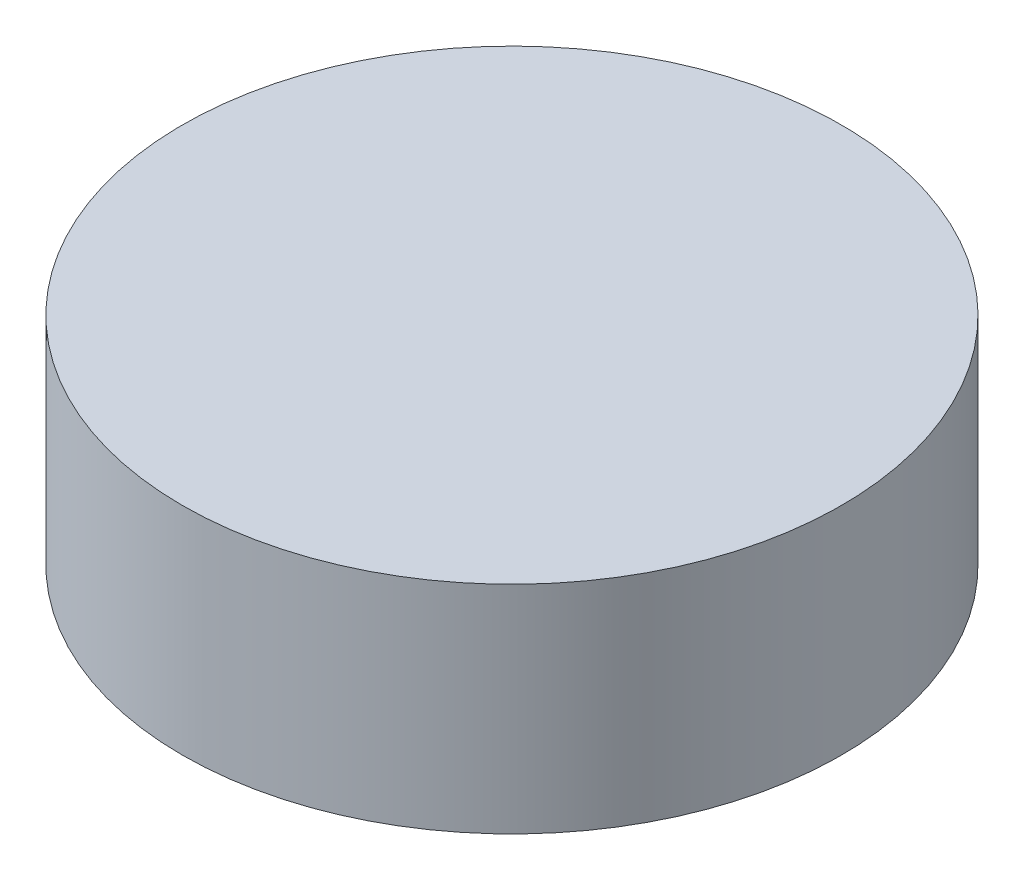
ISO-10303-21;
HEADER;
FILE_DESCRIPTION(('STEP AP214'),'2;1');
FILE_NAME('part.step','',(''),(''),'','','');
FILE_SCHEMA(('AUTOMOTIVE_DESIGN { 1 0 10303 214 1 1 1 1 }'));
ENDSEC;
DATA;
#1=APPLICATION_CONTEXT('core data for automotive mechanical design processes');
#2=APPLICATION_PROTOCOL_DEFINITION('international standard','automotive_design',2000,#1);
#3=PRODUCT_CONTEXT('',#1,'mechanical');
#4=PRODUCT('Part','Part','',(#3));
#5=PRODUCT_RELATED_PRODUCT_CATEGORY('part','',(#4));
#6=PRODUCT_DEFINITION_FORMATION('','',#4);
#7=PRODUCT_DEFINITION_CONTEXT('part definition',#1,'design');
#8=PRODUCT_DEFINITION('design','',#6,#7);
#9=PRODUCT_DEFINITION_SHAPE('','',#8);
#10=(LENGTH_UNIT() NAMED_UNIT(*) SI_UNIT(.MILLI.,.METRE.));
#11=(NAMED_UNIT(*) PLANE_ANGLE_UNIT() SI_UNIT($,.RADIAN.));
#12=(NAMED_UNIT(*) SI_UNIT($,.STERADIAN.) SOLID_ANGLE_UNIT());
#13=UNCERTAINTY_MEASURE_WITH_UNIT(LENGTH_MEASURE(1.E-05),#10,'distance_accuracy_value','');
#14=(GEOMETRIC_REPRESENTATION_CONTEXT(3) GLOBAL_UNCERTAINTY_ASSIGNED_CONTEXT((#13)) GLOBAL_UNIT_ASSIGNED_CONTEXT((#10,
#11,#12)) REPRESENTATION_CONTEXT('',''));
#15=CARTESIAN_POINT('',(0.,0.,0.));
#16=DIRECTION('',(0.,0.,1.));
#17=DIRECTION('',(1.,0.,0.));
#18=AXIS2_PLACEMENT_3D('',#15,#16,#17);
#19=CARTESIAN_POINT('',(0.,50.,0.));
#20=DIRECTION('',(0.,-1.,0.));
#21=DIRECTION('',(0.,0.,-1.));
#22=AXIS2_PLACEMENT_3D('',#19,#20,#21);
#23=CYLINDRICAL_SURFACE('',#22,76.2);
#24=CARTESIAN_POINT('',(0.,50.,0.));
#25=DIRECTION('',(0.,1.,0.));
#26=DIRECTION('',(0.,0.,1.));
#27=AXIS2_PLACEMENT_3D('',#24,#25,#26);
#28=CIRCLE('',#27,76.2);
#29=CARTESIAN_POINT('',(0.,50.,76.2));
#30=VERTEX_POINT('',#29);
#31=EDGE_CURVE('E10',#30,#30,#28,.T.);
#32=ORIENTED_EDGE('',*,*,#31,.F.);
#33=EDGE_LOOP('',(#32));
#34=FACE_BOUND('',#33,.T.);
#35=CARTESIAN_POINT('',(0.,0.,0.));
#36=DIRECTION('',(0.,1.,0.));
#37=DIRECTION('',(0.,0.,1.));
#38=AXIS2_PLACEMENT_3D('',#35,#36,#37);
#39=CIRCLE('',#38,76.2);
#40=CARTESIAN_POINT('',(0.,0.,76.2));
#41=VERTEX_POINT('',#40);
#42=EDGE_CURVE('E40',#41,#41,#39,.T.);
#43=ORIENTED_EDGE('',*,*,#42,.T.);
#44=EDGE_LOOP('',(#43));
#45=FACE_BOUND('',#44,.T.);
#46=ADVANCED_FACE('F37',(#34,#45),#23,.T.);
#47=CARTESIAN_POINT('',(0.,50.,0.));
#48=DIRECTION('',(0.,1.,0.));
#49=DIRECTION('',(0.,0.,1.));
#50=AXIS2_PLACEMENT_3D('',#47,#48,#49);
#51=PLANE('',#50);
#52=ORIENTED_EDGE('',*,*,#31,.T.);
#53=EDGE_LOOP('',(#52));
#54=FACE_BOUND('',#53,.T.);
#55=ADVANCED_FACE('F54',(#54),#51,.T.);
#56=CARTESIAN_POINT('',(0.,0.,0.));
#57=DIRECTION('',(0.,1.,0.));
#58=DIRECTION('',(0.,0.,1.));
#59=AXIS2_PLACEMENT_3D('',#56,#57,#58);
#60=PLANE('',#59);
#61=ORIENTED_EDGE('',*,*,#42,.F.);
#62=EDGE_LOOP('',(#61));
#63=FACE_BOUND('',#62,.T.);
#64=ADVANCED_FACE('F52',(#63),#60,.F.);
#65=CLOSED_SHELL('',(#46,#55,#64));
#66=MANIFOLD_SOLID_BREP('B2',#65);
#67=ADVANCED_BREP_SHAPE_REPRESENTATION('',(#18,#66),#14);
#68=SHAPE_DEFINITION_REPRESENTATION(#9,#67);
ENDSEC;
END-ISO-10303-21;
